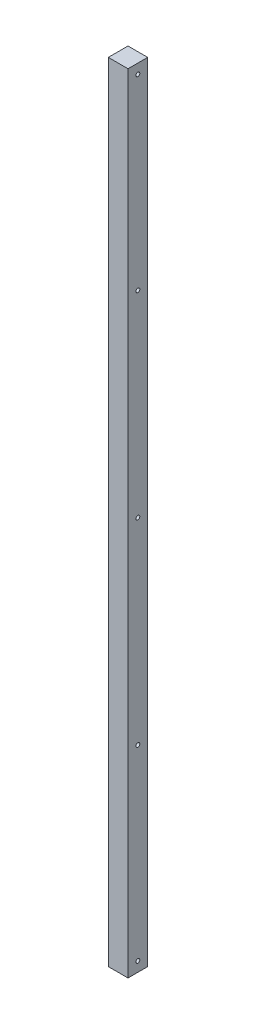
ISO-10303-21;
HEADER;
FILE_DESCRIPTION(('STEP AP214'),'2;1');
FILE_NAME('part.step','',(''),(''),'','','');
FILE_SCHEMA(('AUTOMOTIVE_DESIGN { 1 0 10303 214 1 1 1 1 }'));
ENDSEC;
DATA;
#1=APPLICATION_CONTEXT('core data for automotive mechanical design processes');
#2=APPLICATION_PROTOCOL_DEFINITION('international standard','automotive_design',2000,#1);
#3=PRODUCT_CONTEXT('',#1,'mechanical');
#4=PRODUCT('Part','Part','',(#3));
#5=PRODUCT_RELATED_PRODUCT_CATEGORY('part','',(#4));
#6=PRODUCT_DEFINITION_FORMATION('','',#4);
#7=PRODUCT_DEFINITION_CONTEXT('part definition',#1,'design');
#8=PRODUCT_DEFINITION('design','',#6,#7);
#9=PRODUCT_DEFINITION_SHAPE('','',#8);
#10=(LENGTH_UNIT() NAMED_UNIT(*) SI_UNIT(.MILLI.,.METRE.));
#11=(NAMED_UNIT(*) PLANE_ANGLE_UNIT() SI_UNIT($,.RADIAN.));
#12=(NAMED_UNIT(*) SI_UNIT($,.STERADIAN.) SOLID_ANGLE_UNIT());
#13=UNCERTAINTY_MEASURE_WITH_UNIT(LENGTH_MEASURE(1.E-05),#10,'distance_accuracy_value','');
#14=(GEOMETRIC_REPRESENTATION_CONTEXT(3) GLOBAL_UNCERTAINTY_ASSIGNED_CONTEXT((#13)) GLOBAL_UNIT_ASSIGNED_CONTEXT((#10,
#11,#12)) REPRESENTATION_CONTEXT('',''));
#15=CARTESIAN_POINT('',(0.,0.,0.));
#16=DIRECTION('',(0.,0.,1.));
#17=DIRECTION('',(1.,0.,0.));
#18=AXIS2_PLACEMENT_3D('',#15,#16,#17);
#19=CARTESIAN_POINT('',(25.,2000.,-25.));
#20=DIRECTION('',(0.,0.,1.));
#21=DIRECTION('',(1.,0.,0.));
#22=AXIS2_PLACEMENT_3D('',#19,#20,#21);
#23=PLANE('',#22);
#24=DIRECTION('',(-1.,0.,0.));
#25=VECTOR('',#24,1.);
#26=CARTESIAN_POINT('',(25.,0.,-25.));
#27=LINE('',#26,#25);
#28=CARTESIAN_POINT('',(25.,0.,-25.));
#29=VERTEX_POINT('',#28);
#30=CARTESIAN_POINT('',(-25.,0.,-25.));
#31=VERTEX_POINT('',#30);
#32=EDGE_CURVE('E110',#29,#31,#27,.T.);
#33=ORIENTED_EDGE('',*,*,#32,.T.);
#34=DIRECTION('',(0.,-1.,0.));
#35=VECTOR('',#34,1.);
#36=CARTESIAN_POINT('',(-25.,2000.,-25.));
#37=LINE('',#36,#35);
#38=CARTESIAN_POINT('',(-25.,2000.,-25.));
#39=VERTEX_POINT('',#38);
#40=EDGE_CURVE('E11',#39,#31,#37,.T.);
#41=ORIENTED_EDGE('',*,*,#40,.F.);
#42=DIRECTION('',(-1.,0.,0.));
#43=VECTOR('',#42,1.);
#44=CARTESIAN_POINT('',(25.,2000.,-25.));
#45=LINE('',#44,#43);
#46=CARTESIAN_POINT('',(25.,2000.,-25.));
#47=VERTEX_POINT('',#46);
#48=EDGE_CURVE('E92',#47,#39,#45,.T.);
#49=ORIENTED_EDGE('',*,*,#48,.F.);
#50=DIRECTION('',(0.,-1.,0.));
#51=VECTOR('',#50,1.);
#52=CARTESIAN_POINT('',(25.,2000.,-25.));
#53=LINE('',#52,#51);
#54=EDGE_CURVE('E59',#47,#29,#53,.T.);
#55=ORIENTED_EDGE('',*,*,#54,.T.);
#56=EDGE_LOOP('',(#33,#41,#49,#55));
#57=FACE_BOUND('',#56,.T.);
#58=ADVANCED_FACE('F42',(#57),#23,.F.);
#59=CARTESIAN_POINT('',(-25.,2000.,-25.));
#60=DIRECTION('',(1.,0.,0.));
#61=DIRECTION('',(0.,0.,-1.));
#62=AXIS2_PLACEMENT_3D('',#59,#60,#61);
#63=PLANE('',#62);
#64=CARTESIAN_POINT('',(-25.,1500.,0.));
#65=DIRECTION('',(1.,0.,0.));
#66=DIRECTION('',(0.,0.,-1.));
#67=AXIS2_PLACEMENT_3D('',#64,#65,#66);
#68=CIRCLE('',#67,5.);
#69=CARTESIAN_POINT('',(-25.,1500.,-5.));
#70=VERTEX_POINT('',#69);
#71=EDGE_CURVE('E149',#70,#70,#68,.T.);
#72=ORIENTED_EDGE('',*,*,#71,.T.);
#73=EDGE_LOOP('',(#72));
#74=FACE_BOUND('',#73,.T.);
#75=CARTESIAN_POINT('',(-25.,500.,0.));
#76=DIRECTION('',(1.,0.,0.));
#77=DIRECTION('',(0.,0.,-1.));
#78=AXIS2_PLACEMENT_3D('',#75,#76,#77);
#79=CIRCLE('',#78,5.);
#80=CARTESIAN_POINT('',(-25.,500.,-5.));
#81=VERTEX_POINT('',#80);
#82=EDGE_CURVE('E153',#81,#81,#79,.T.);
#83=ORIENTED_EDGE('',*,*,#82,.T.);
#84=EDGE_LOOP('',(#83));
#85=FACE_BOUND('',#84,.T.);
#86=CARTESIAN_POINT('',(-25.,1000.,0.));
#87=DIRECTION('',(1.,0.,0.));
#88=DIRECTION('',(0.,0.,-1.));
#89=AXIS2_PLACEMENT_3D('',#86,#87,#88);
#90=CIRCLE('',#89,5.00000000000001);
#91=CARTESIAN_POINT('',(-25.,1000.,-5.00000000000001));
#92=VERTEX_POINT('',#91);
#93=EDGE_CURVE('E134',#92,#92,#90,.T.);
#94=ORIENTED_EDGE('',*,*,#93,.T.);
#95=EDGE_LOOP('',(#94));
#96=FACE_BOUND('',#95,.T.);
#97=CARTESIAN_POINT('',(-25.,1975.,0.));
#98=DIRECTION('',(1.,0.,0.));
#99=DIRECTION('',(0.,0.,-1.));
#100=AXIS2_PLACEMENT_3D('',#97,#98,#99);
#101=CIRCLE('',#100,5.);
#102=CARTESIAN_POINT('',(-25.,1975.,-4.99999999999999));
#103=VERTEX_POINT('',#102);
#104=EDGE_CURVE('E113',#103,#103,#101,.T.);
#105=ORIENTED_EDGE('',*,*,#104,.T.);
#106=EDGE_LOOP('',(#105));
#107=FACE_BOUND('',#106,.T.);
#108=CARTESIAN_POINT('',(-25.,25.,0.));
#109=DIRECTION('',(1.,0.,0.));
#110=DIRECTION('',(0.,0.,-1.));
#111=AXIS2_PLACEMENT_3D('',#108,#109,#110);
#112=CIRCLE('',#111,5.);
#113=CARTESIAN_POINT('',(-25.,25.,-5.));
#114=VERTEX_POINT('',#113);
#115=EDGE_CURVE('E129',#114,#114,#112,.T.);
#116=ORIENTED_EDGE('',*,*,#115,.T.);
#117=EDGE_LOOP('',(#116));
#118=FACE_BOUND('',#117,.T.);
#119=DIRECTION('',(0.,0.,1.));
#120=VECTOR('',#119,1.);
#121=CARTESIAN_POINT('',(-25.,0.,-25.));
#122=LINE('',#121,#120);
#123=CARTESIAN_POINT('',(-25.,0.,25.));
#124=VERTEX_POINT('',#123);
#125=EDGE_CURVE('E98',#31,#124,#122,.T.);
#126=ORIENTED_EDGE('',*,*,#125,.T.);
#127=DIRECTION('',(0.,-1.,0.));
#128=VECTOR('',#127,1.);
#129=CARTESIAN_POINT('',(-25.,2000.,25.));
#130=LINE('',#129,#128);
#131=CARTESIAN_POINT('',(-25.,2000.,25.));
#132=VERTEX_POINT('',#131);
#133=EDGE_CURVE('E51',#132,#124,#130,.T.);
#134=ORIENTED_EDGE('',*,*,#133,.F.);
#135=DIRECTION('',(0.,0.,1.));
#136=VECTOR('',#135,1.);
#137=CARTESIAN_POINT('',(-25.,2000.,-25.));
#138=LINE('',#137,#136);
#139=EDGE_CURVE('E84',#39,#132,#138,.T.);
#140=ORIENTED_EDGE('',*,*,#139,.F.);
#141=ORIENTED_EDGE('',*,*,#40,.T.);
#142=EDGE_LOOP('',(#126,#134,#140,#141));
#143=FACE_BOUND('',#142,.T.);
#144=ADVANCED_FACE('F97',(#74,#85,#96,#107,#118,#143),#63,.F.);
#145=CARTESIAN_POINT('',(25.,2000.,25.));
#146=DIRECTION('',(0.,0.,1.));
#147=DIRECTION('',(1.,0.,0.));
#148=AXIS2_PLACEMENT_3D('',#145,#146,#147);
#149=PLANE('',#148);
#150=DIRECTION('',(-1.,0.,0.));
#151=VECTOR('',#150,1.);
#152=CARTESIAN_POINT('',(25.,0.,25.));
#153=LINE('',#152,#151);
#154=CARTESIAN_POINT('',(25.,0.,25.));
#155=VERTEX_POINT('',#154);
#156=EDGE_CURVE('E116',#155,#124,#153,.T.);
#157=ORIENTED_EDGE('',*,*,#156,.F.);
#158=DIRECTION('',(0.,-1.,0.));
#159=VECTOR('',#158,1.);
#160=CARTESIAN_POINT('',(25.,2000.,25.));
#161=LINE('',#160,#159);
#162=CARTESIAN_POINT('',(25.,2000.,25.));
#163=VERTEX_POINT('',#162);
#164=EDGE_CURVE('E73',#163,#155,#161,.T.);
#165=ORIENTED_EDGE('',*,*,#164,.F.);
#166=DIRECTION('',(-1.,0.,0.));
#167=VECTOR('',#166,1.);
#168=CARTESIAN_POINT('',(25.,2000.,25.));
#169=LINE('',#168,#167);
#170=EDGE_CURVE('E91',#163,#132,#169,.T.);
#171=ORIENTED_EDGE('',*,*,#170,.T.);
#172=ORIENTED_EDGE('',*,*,#133,.T.);
#173=EDGE_LOOP('',(#157,#165,#171,#172));
#174=FACE_BOUND('',#173,.T.);
#175=ADVANCED_FACE('F102',(#174),#149,.T.);
#176=CARTESIAN_POINT('',(25.,2000.,-25.));
#177=DIRECTION('',(1.,0.,0.));
#178=DIRECTION('',(0.,0.,-1.));
#179=AXIS2_PLACEMENT_3D('',#176,#177,#178);
#180=PLANE('',#179);
#181=CARTESIAN_POINT('',(25.,1500.,0.));
#182=DIRECTION('',(1.,0.,0.));
#183=DIRECTION('',(0.,0.,-1.));
#184=AXIS2_PLACEMENT_3D('',#181,#182,#183);
#185=CIRCLE('',#184,5.);
#186=CARTESIAN_POINT('',(25.,1500.,-5.));
#187=VERTEX_POINT('',#186);
#188=EDGE_CURVE('E161',#187,#187,#185,.T.);
#189=ORIENTED_EDGE('',*,*,#188,.F.);
#190=EDGE_LOOP('',(#189));
#191=FACE_BOUND('',#190,.T.);
#192=CARTESIAN_POINT('',(25.,500.,0.));
#193=DIRECTION('',(1.,0.,0.));
#194=DIRECTION('',(0.,0.,-1.));
#195=AXIS2_PLACEMENT_3D('',#192,#193,#194);
#196=CIRCLE('',#195,5.);
#197=CARTESIAN_POINT('',(25.,500.,-5.));
#198=VERTEX_POINT('',#197);
#199=EDGE_CURVE('E157',#198,#198,#196,.T.);
#200=ORIENTED_EDGE('',*,*,#199,.F.);
#201=EDGE_LOOP('',(#200));
#202=FACE_BOUND('',#201,.T.);
#203=CARTESIAN_POINT('',(25.,1000.,0.));
#204=DIRECTION('',(1.,0.,0.));
#205=DIRECTION('',(0.,0.,-1.));
#206=AXIS2_PLACEMENT_3D('',#203,#204,#205);
#207=CIRCLE('',#206,5.00000000000001);
#208=CARTESIAN_POINT('',(25.,1000.,-5.00000000000001));
#209=VERTEX_POINT('',#208);
#210=EDGE_CURVE('E145',#209,#209,#207,.T.);
#211=ORIENTED_EDGE('',*,*,#210,.F.);
#212=EDGE_LOOP('',(#211));
#213=FACE_BOUND('',#212,.T.);
#214=CARTESIAN_POINT('',(25.,1975.,0.));
#215=DIRECTION('',(1.,0.,0.));
#216=DIRECTION('',(0.,0.,-1.));
#217=AXIS2_PLACEMENT_3D('',#214,#215,#216);
#218=CIRCLE('',#217,5.);
#219=CARTESIAN_POINT('',(25.,1975.,-4.99999999999999));
#220=VERTEX_POINT('',#219);
#221=EDGE_CURVE('E138',#220,#220,#218,.T.);
#222=ORIENTED_EDGE('',*,*,#221,.F.);
#223=EDGE_LOOP('',(#222));
#224=FACE_BOUND('',#223,.T.);
#225=CARTESIAN_POINT('',(25.,25.,0.));
#226=DIRECTION('',(1.,0.,0.));
#227=DIRECTION('',(0.,0.,-1.));
#228=AXIS2_PLACEMENT_3D('',#225,#226,#227);
#229=CIRCLE('',#228,5.);
#230=CARTESIAN_POINT('',(25.,25.,-5.));
#231=VERTEX_POINT('',#230);
#232=EDGE_CURVE('E133',#231,#231,#229,.T.);
#233=ORIENTED_EDGE('',*,*,#232,.F.);
#234=EDGE_LOOP('',(#233));
#235=FACE_BOUND('',#234,.T.);
#236=DIRECTION('',(0.,0.,1.));
#237=VECTOR('',#236,1.);
#238=CARTESIAN_POINT('',(25.,0.,-25.));
#239=LINE('',#238,#237);
#240=EDGE_CURVE('E119',#29,#155,#239,.T.);
#241=ORIENTED_EDGE('',*,*,#240,.F.);
#242=ORIENTED_EDGE('',*,*,#54,.F.);
#243=DIRECTION('',(0.,0.,1.));
#244=VECTOR('',#243,1.);
#245=CARTESIAN_POINT('',(25.,2000.,-25.));
#246=LINE('',#245,#244);
#247=EDGE_CURVE('E104',#47,#163,#246,.T.);
#248=ORIENTED_EDGE('',*,*,#247,.T.);
#249=ORIENTED_EDGE('',*,*,#164,.T.);
#250=EDGE_LOOP('',(#241,#242,#248,#249));
#251=FACE_BOUND('',#250,.T.);
#252=ADVANCED_FACE('F178',(#191,#202,#213,#224,#235,#251),#180,.T.);
#253=CARTESIAN_POINT('',(0.,2000.,0.));
#254=DIRECTION('',(0.,1.,0.));
#255=DIRECTION('',(0.,0.,1.));
#256=AXIS2_PLACEMENT_3D('',#253,#254,#255);
#257=PLANE('',#256);
#258=ORIENTED_EDGE('',*,*,#48,.T.);
#259=ORIENTED_EDGE('',*,*,#139,.T.);
#260=ORIENTED_EDGE('',*,*,#170,.F.);
#261=ORIENTED_EDGE('',*,*,#247,.F.);
#262=EDGE_LOOP('',(#258,#259,#260,#261));
#263=FACE_BOUND('',#262,.T.);
#264=ADVANCED_FACE('F88',(#263),#257,.T.);
#265=CARTESIAN_POINT('',(0.,0.,0.));
#266=DIRECTION('',(0.,1.,0.));
#267=DIRECTION('',(0.,0.,1.));
#268=AXIS2_PLACEMENT_3D('',#265,#266,#267);
#269=PLANE('',#268);
#270=ORIENTED_EDGE('',*,*,#32,.F.);
#271=ORIENTED_EDGE('',*,*,#240,.T.);
#272=ORIENTED_EDGE('',*,*,#156,.T.);
#273=ORIENTED_EDGE('',*,*,#125,.F.);
#274=EDGE_LOOP('',(#270,#271,#272,#273));
#275=FACE_BOUND('',#274,.T.);
#276=ADVANCED_FACE('F193',(#275),#269,.F.);
#277=CARTESIAN_POINT('',(-25.,25.,0.));
#278=DIRECTION('',(1.,0.,0.));
#279=DIRECTION('',(0.,0.,-1.));
#280=AXIS2_PLACEMENT_3D('',#277,#278,#279);
#281=CYLINDRICAL_SURFACE('',#280,5.);
#282=ORIENTED_EDGE('',*,*,#115,.F.);
#283=EDGE_LOOP('',(#282));
#284=FACE_BOUND('',#283,.T.);
#285=ORIENTED_EDGE('',*,*,#232,.T.);
#286=EDGE_LOOP('',(#285));
#287=FACE_BOUND('',#286,.T.);
#288=ADVANCED_FACE('F190',(#284,#287),#281,.F.);
#289=CARTESIAN_POINT('',(-25.,1975.,0.));
#290=DIRECTION('',(1.,0.,0.));
#291=DIRECTION('',(0.,0.,-1.));
#292=AXIS2_PLACEMENT_3D('',#289,#290,#291);
#293=CYLINDRICAL_SURFACE('',#292,5.);
#294=ORIENTED_EDGE('',*,*,#104,.F.);
#295=EDGE_LOOP('',(#294));
#296=FACE_BOUND('',#295,.T.);
#297=ORIENTED_EDGE('',*,*,#221,.T.);
#298=EDGE_LOOP('',(#297));
#299=FACE_BOUND('',#298,.T.);
#300=ADVANCED_FACE('F192',(#296,#299),#293,.F.);
#301=CARTESIAN_POINT('',(-25.,1000.,0.));
#302=DIRECTION('',(1.,0.,0.));
#303=DIRECTION('',(0.,0.,-1.));
#304=AXIS2_PLACEMENT_3D('',#301,#302,#303);
#305=CYLINDRICAL_SURFACE('',#304,5.00000000000001);
#306=ORIENTED_EDGE('',*,*,#93,.F.);
#307=EDGE_LOOP('',(#306));
#308=FACE_BOUND('',#307,.T.);
#309=ORIENTED_EDGE('',*,*,#210,.T.);
#310=EDGE_LOOP('',(#309));
#311=FACE_BOUND('',#310,.T.);
#312=ADVANCED_FACE('F200',(#308,#311),#305,.F.);
#313=CARTESIAN_POINT('',(-25.,500.,0.));
#314=DIRECTION('',(1.,0.,0.));
#315=DIRECTION('',(0.,0.,-1.));
#316=AXIS2_PLACEMENT_3D('',#313,#314,#315);
#317=CYLINDRICAL_SURFACE('',#316,5.);
#318=ORIENTED_EDGE('',*,*,#82,.F.);
#319=EDGE_LOOP('',(#318));
#320=FACE_BOUND('',#319,.T.);
#321=ORIENTED_EDGE('',*,*,#199,.T.);
#322=EDGE_LOOP('',(#321));
#323=FACE_BOUND('',#322,.T.);
#324=ADVANCED_FACE('F174',(#320,#323),#317,.F.);
#325=CARTESIAN_POINT('',(-25.,1500.,0.));
#326=DIRECTION('',(1.,0.,0.));
#327=DIRECTION('',(0.,0.,-1.));
#328=AXIS2_PLACEMENT_3D('',#325,#326,#327);
#329=CYLINDRICAL_SURFACE('',#328,5.);
#330=ORIENTED_EDGE('',*,*,#71,.F.);
#331=EDGE_LOOP('',(#330));
#332=FACE_BOUND('',#331,.T.);
#333=ORIENTED_EDGE('',*,*,#188,.T.);
#334=EDGE_LOOP('',(#333));
#335=FACE_BOUND('',#334,.T.);
#336=ADVANCED_FACE('F171',(#332,#335),#329,.F.);
#337=CLOSED_SHELL('',(#58,#144,#175,#252,#264,#276,#288,#300,#312,#324,#336));
#338=MANIFOLD_SOLID_BREP('B2',#337);
#339=ADVANCED_BREP_SHAPE_REPRESENTATION('',(#18,#338),#14);
#340=SHAPE_DEFINITION_REPRESENTATION(#9,#339);
ENDSEC;
END-ISO-10303-21;
